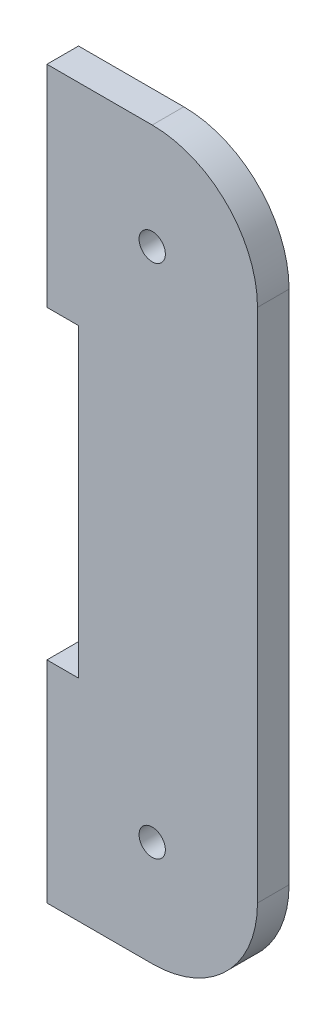
ISO-10303-21;
HEADER;
FILE_DESCRIPTION(('STEP AP214'),'2;1');
FILE_NAME('part.step','',(''),(''),'','','');
FILE_SCHEMA(('AUTOMOTIVE_DESIGN { 1 0 10303 214 1 1 1 1 }'));
ENDSEC;
DATA;
#1=APPLICATION_CONTEXT('core data for automotive mechanical design processes');
#2=APPLICATION_PROTOCOL_DEFINITION('international standard','automotive_design',2000,#1);
#3=PRODUCT_CONTEXT('',#1,'mechanical');
#4=PRODUCT('Part','Part','',(#3));
#5=PRODUCT_RELATED_PRODUCT_CATEGORY('part','',(#4));
#6=PRODUCT_DEFINITION_FORMATION('','',#4);
#7=PRODUCT_DEFINITION_CONTEXT('part definition',#1,'design');
#8=PRODUCT_DEFINITION('design','',#6,#7);
#9=PRODUCT_DEFINITION_SHAPE('','',#8);
#10=(LENGTH_UNIT() NAMED_UNIT(*) SI_UNIT(.MILLI.,.METRE.));
#11=(NAMED_UNIT(*) PLANE_ANGLE_UNIT() SI_UNIT($,.RADIAN.));
#12=(NAMED_UNIT(*) SI_UNIT($,.STERADIAN.) SOLID_ANGLE_UNIT());
#13=UNCERTAINTY_MEASURE_WITH_UNIT(LENGTH_MEASURE(1.E-05),#10,'distance_accuracy_value','');
#14=(GEOMETRIC_REPRESENTATION_CONTEXT(3) GLOBAL_UNCERTAINTY_ASSIGNED_CONTEXT((#13)) GLOBAL_UNIT_ASSIGNED_CONTEXT((#10,
#11,#12)) REPRESENTATION_CONTEXT('',''));
#15=CARTESIAN_POINT('',(0.,0.,0.));
#16=DIRECTION('',(0.,0.,1.));
#17=DIRECTION('',(1.,0.,0.));
#18=AXIS2_PLACEMENT_3D('',#15,#16,#17);
#19=CARTESIAN_POINT('',(-10.2040816326531,54.0510204081632,3.));
#20=DIRECTION('',(1.,0.,0.));
#21=DIRECTION('',(0.,1.,0.));
#22=AXIS2_PLACEMENT_3D('',#19,#20,#21);
#23=PLANE('',#22);
#24=DIRECTION('',(0.,0.,-1.));
#25=VECTOR('',#24,1.);
#26=CARTESIAN_POINT('',(-10.2040816326531,5.05102040816324,3.));
#27=LINE('',#26,#25);
#28=CARTESIAN_POINT('',(-10.2040816326531,5.05102040816324,3.));
#29=VERTEX_POINT('',#28);
#30=CARTESIAN_POINT('',(-10.2040816326531,5.05102040816324,0.));
#31=VERTEX_POINT('',#30);
#32=EDGE_CURVE('E112',#29,#31,#27,.T.);
#33=ORIENTED_EDGE('',*,*,#32,.T.);
#34=DIRECTION('',(0.,-1.,0.));
#35=VECTOR('',#34,1.);
#36=CARTESIAN_POINT('',(-10.2040816326531,54.0510204081632,0.));
#37=LINE('',#36,#35);
#38=CARTESIAN_POINT('',(-10.2040816326531,-14.9489795918368,0.));
#39=VERTEX_POINT('',#38);
#40=EDGE_CURVE('E122',#31,#39,#37,.T.);
#41=ORIENTED_EDGE('',*,*,#40,.T.);
#42=DIRECTION('',(0.,0.,-1.));
#43=VECTOR('',#42,1.);
#44=CARTESIAN_POINT('',(-10.2040816326531,-14.9489795918368,3.));
#45=LINE('',#44,#43);
#46=CARTESIAN_POINT('',(-10.2040816326531,-14.9489795918368,3.));
#47=VERTEX_POINT('',#46);
#48=EDGE_CURVE('E134',#47,#39,#45,.T.);
#49=ORIENTED_EDGE('',*,*,#48,.F.);
#50=DIRECTION('',(0.,-1.,0.));
#51=VECTOR('',#50,1.);
#52=CARTESIAN_POINT('',(-10.2040816326531,54.0510204081632,3.));
#53=LINE('',#52,#51);
#54=EDGE_CURVE('E127',#29,#47,#53,.T.);
#55=ORIENTED_EDGE('',*,*,#54,.F.);
#56=EDGE_LOOP('',(#33,#41,#49,#55));
#57=FACE_BOUND('',#56,.T.);
#58=ADVANCED_FACE('F33',(#57),#23,.F.);
#59=DIRECTION('',(0.,0.,-1.));
#60=VECTOR('',#59,1.);
#61=CARTESIAN_POINT('',(-10.2040816326531,34.0510204081632,3.));
#62=LINE('',#61,#60);
#63=CARTESIAN_POINT('',(-10.2040816326531,34.0510204081632,3.));
#64=VERTEX_POINT('',#63);
#65=CARTESIAN_POINT('',(-10.2040816326531,34.0510204081632,0.));
#66=VERTEX_POINT('',#65);
#67=EDGE_CURVE('E242',#64,#66,#62,.T.);
#68=ORIENTED_EDGE('',*,*,#67,.F.);
#69=CARTESIAN_POINT('',(-10.2040816326531,54.0510204081632,3.));
#70=VERTEX_POINT('',#69);
#71=EDGE_CURVE('E135',#70,#64,#53,.T.);
#72=ORIENTED_EDGE('',*,*,#71,.F.);
#73=DIRECTION('',(0.,0.,-1.));
#74=VECTOR('',#73,1.);
#75=CARTESIAN_POINT('',(-10.2040816326531,54.0510204081632,3.));
#76=LINE('',#75,#74);
#77=CARTESIAN_POINT('',(-10.2040816326531,54.0510204081632,0.));
#78=VERTEX_POINT('',#77);
#79=EDGE_CURVE('E149',#70,#78,#76,.T.);
#80=ORIENTED_EDGE('',*,*,#79,.T.);
#81=EDGE_CURVE('E150',#78,#66,#37,.T.);
#82=ORIENTED_EDGE('',*,*,#81,.T.);
#83=EDGE_LOOP('',(#68,#72,#80,#82));
#84=FACE_BOUND('',#83,.T.);
#85=ADVANCED_FACE('F195',(#84),#23,.F.);
#86=CARTESIAN_POINT('',(0.,0.,3.));
#87=DIRECTION('',(0.,0.,1.));
#88=DIRECTION('',(1.,0.,0.));
#89=AXIS2_PLACEMENT_3D('',#86,#87,#88);
#90=PLANE('',#89);
#91=CARTESIAN_POINT('',(-0.204081632653046,44.0510204081632,3.));
#92=DIRECTION('',(0.,0.,-1.));
#93=DIRECTION('',(-1.,0.,0.));
#94=AXIS2_PLACEMENT_3D('',#91,#92,#93);
#95=CIRCLE('',#94,1.25);
#96=CARTESIAN_POINT('',(-1.45408163265305,44.0510204081632,3.));
#97=VERTEX_POINT('',#96);
#98=EDGE_CURVE('E264',#97,#97,#95,.T.);
#99=ORIENTED_EDGE('',*,*,#98,.T.);
#100=EDGE_LOOP('',(#99));
#101=FACE_BOUND('',#100,.T.);
#102=CARTESIAN_POINT('',(-0.204081632653052,-4.94897959183675,3.));
#103=DIRECTION('',(0.,0.,-1.));
#104=DIRECTION('',(-1.,0.,0.));
#105=AXIS2_PLACEMENT_3D('',#102,#103,#104);
#106=CIRCLE('',#105,1.25);
#107=CARTESIAN_POINT('',(-1.45408163265305,-4.94897959183675,3.));
#108=VERTEX_POINT('',#107);
#109=EDGE_CURVE('E252',#108,#108,#106,.T.);
#110=ORIENTED_EDGE('',*,*,#109,.T.);
#111=EDGE_LOOP('',(#110));
#112=FACE_BOUND('',#111,.T.);
#113=DIRECTION('',(1.,0.,0.));
#114=VECTOR('',#113,1.);
#115=CARTESIAN_POINT('',(-10.2040816326531,-14.9489795918368,3.));
#116=LINE('',#115,#114);
#117=CARTESIAN_POINT('',(-0.204081632653055,-14.9489795918368,3.));
#118=VERTEX_POINT('',#117);
#119=EDGE_CURVE('E139',#47,#118,#116,.T.);
#120=ORIENTED_EDGE('',*,*,#119,.T.);
#121=CARTESIAN_POINT('',(-0.204081632653055,-4.94897959183675,3.));
#122=DIRECTION('',(0.,0.,1.));
#123=DIRECTION('',(1.,0.,0.));
#124=AXIS2_PLACEMENT_3D('',#121,#122,#123);
#125=CIRCLE('',#124,10.);
#126=CARTESIAN_POINT('',(9.79591836734695,-4.94897959183675,3.));
#127=VERTEX_POINT('',#126);
#128=EDGE_CURVE('E41',#118,#127,#125,.T.);
#129=ORIENTED_EDGE('',*,*,#128,.T.);
#130=DIRECTION('',(0.,1.,0.));
#131=VECTOR('',#130,1.);
#132=CARTESIAN_POINT('',(9.79591836734694,54.0510204081632,3.));
#133=LINE('',#132,#131);
#134=CARTESIAN_POINT('',(9.79591836734694,44.0510204081632,3.));
#135=VERTEX_POINT('',#134);
#136=EDGE_CURVE('E145',#127,#135,#133,.T.);
#137=ORIENTED_EDGE('',*,*,#136,.T.);
#138=CARTESIAN_POINT('',(-0.20408163265306,44.0510204081632,3.));
#139=DIRECTION('',(0.,0.,1.));
#140=DIRECTION('',(1.,0.,0.));
#141=AXIS2_PLACEMENT_3D('',#138,#139,#140);
#142=CIRCLE('',#141,10.);
#143=CARTESIAN_POINT('',(-0.20408163265306,54.0510204081632,3.));
#144=VERTEX_POINT('',#143);
#145=EDGE_CURVE('E48',#135,#144,#142,.T.);
#146=ORIENTED_EDGE('',*,*,#145,.T.);
#147=DIRECTION('',(-1.,0.,0.));
#148=VECTOR('',#147,1.);
#149=CARTESIAN_POINT('',(-10.2040816326531,54.0510204081632,3.));
#150=LINE('',#149,#148);
#151=EDGE_CURVE('E147',#144,#70,#150,.T.);
#152=ORIENTED_EDGE('',*,*,#151,.T.);
#153=ORIENTED_EDGE('',*,*,#71,.T.);
#154=DIRECTION('',(-1.,0.,0.));
#155=VECTOR('',#154,1.);
#156=CARTESIAN_POINT('',(-10.2040816326531,34.0510204081632,3.));
#157=LINE('',#156,#155);
#158=CARTESIAN_POINT('',(-7.20408163265306,34.0510204081632,3.));
#159=VERTEX_POINT('',#158);
#160=EDGE_CURVE('E243',#159,#64,#157,.T.);
#161=ORIENTED_EDGE('',*,*,#160,.F.);
#162=DIRECTION('',(0.,1.,0.));
#163=VECTOR('',#162,1.);
#164=CARTESIAN_POINT('',(-7.20408163265306,34.0510204081632,3.));
#165=LINE('',#164,#163);
#166=CARTESIAN_POINT('',(-7.20408163265306,5.05102040816324,3.));
#167=VERTEX_POINT('',#166);
#168=EDGE_CURVE('E129',#167,#159,#165,.T.);
#169=ORIENTED_EDGE('',*,*,#168,.F.);
#170=DIRECTION('',(1.,0.,0.));
#171=VECTOR('',#170,1.);
#172=CARTESIAN_POINT('',(-10.2040816326531,5.05102040816324,3.));
#173=LINE('',#172,#171);
#174=EDGE_CURVE('E115',#29,#167,#173,.T.);
#175=ORIENTED_EDGE('',*,*,#174,.F.);
#176=ORIENTED_EDGE('',*,*,#54,.T.);
#177=EDGE_LOOP('',(#120,#129,#137,#146,#152,#153,#161,#169,#175,#176));
#178=FACE_BOUND('',#177,.T.);
#179=ADVANCED_FACE('F126',(#101,#112,#178),#90,.T.);
#180=CARTESIAN_POINT('',(0.,0.,0.));
#181=DIRECTION('',(0.,0.,1.));
#182=DIRECTION('',(1.,0.,0.));
#183=AXIS2_PLACEMENT_3D('',#180,#181,#182);
#184=PLANE('',#183);
#185=CARTESIAN_POINT('',(-0.204081632653046,44.0510204081632,0.));
#186=DIRECTION('',(0.,0.,-1.));
#187=DIRECTION('',(-1.,0.,0.));
#188=AXIS2_PLACEMENT_3D('',#185,#186,#187);
#189=CIRCLE('',#188,1.24999999999999);
#190=CARTESIAN_POINT('',(-1.45408163265303,44.0510204081632,0.));
#191=VERTEX_POINT('',#190);
#192=EDGE_CURVE('E269',#191,#191,#189,.T.);
#193=ORIENTED_EDGE('',*,*,#192,.F.);
#194=EDGE_LOOP('',(#193));
#195=FACE_BOUND('',#194,.T.);
#196=CARTESIAN_POINT('',(-0.204081632653052,-4.94897959183675,0.));
#197=DIRECTION('',(0.,0.,-1.));
#198=DIRECTION('',(-1.,0.,0.));
#199=AXIS2_PLACEMENT_3D('',#196,#197,#198);
#200=CIRCLE('',#199,1.24999999999999);
#201=CARTESIAN_POINT('',(-1.45408163265304,-4.94897959183675,0.));
#202=VERTEX_POINT('',#201);
#203=EDGE_CURVE('E259',#202,#202,#200,.T.);
#204=ORIENTED_EDGE('',*,*,#203,.F.);
#205=EDGE_LOOP('',(#204));
#206=FACE_BOUND('',#205,.T.);
#207=DIRECTION('',(0.,1.,0.));
#208=VECTOR('',#207,1.);
#209=CARTESIAN_POINT('',(9.79591836734694,54.0510204081632,0.));
#210=LINE('',#209,#208);
#211=CARTESIAN_POINT('',(9.79591836734695,-4.94897959183675,0.));
#212=VERTEX_POINT('',#211);
#213=CARTESIAN_POINT('',(9.79591836734694,44.0510204081632,0.));
#214=VERTEX_POINT('',#213);
#215=EDGE_CURVE('E140',#212,#214,#210,.T.);
#216=ORIENTED_EDGE('',*,*,#215,.F.);
#217=CARTESIAN_POINT('',(-0.204081632653055,-4.94897959183675,0.));
#218=DIRECTION('',(0.,0.,1.));
#219=DIRECTION('',(1.,0.,0.));
#220=AXIS2_PLACEMENT_3D('',#217,#218,#219);
#221=CIRCLE('',#220,10.);
#222=CARTESIAN_POINT('',(-0.204081632653055,-14.9489795918368,0.));
#223=VERTEX_POINT('',#222);
#224=EDGE_CURVE('E167',#212,#223,#221,.F.);
#225=ORIENTED_EDGE('',*,*,#224,.T.);
#226=DIRECTION('',(1.,0.,0.));
#227=VECTOR('',#226,1.);
#228=CARTESIAN_POINT('',(-10.2040816326531,-14.9489795918368,0.));
#229=LINE('',#228,#227);
#230=EDGE_CURVE('E153',#39,#223,#229,.T.);
#231=ORIENTED_EDGE('',*,*,#230,.F.);
#232=ORIENTED_EDGE('',*,*,#40,.F.);
#233=DIRECTION('',(1.,0.,0.));
#234=VECTOR('',#233,1.);
#235=CARTESIAN_POINT('',(-10.2040816326531,5.05102040816324,0.));
#236=LINE('',#235,#234);
#237=CARTESIAN_POINT('',(-7.20408163265306,5.05102040816324,0.));
#238=VERTEX_POINT('',#237);
#239=EDGE_CURVE('E118',#31,#238,#236,.T.);
#240=ORIENTED_EDGE('',*,*,#239,.T.);
#241=DIRECTION('',(0.,1.,0.));
#242=VECTOR('',#241,1.);
#243=CARTESIAN_POINT('',(-7.20408163265306,34.0510204081632,0.));
#244=LINE('',#243,#242);
#245=CARTESIAN_POINT('',(-7.20408163265306,34.0510204081632,0.));
#246=VERTEX_POINT('',#245);
#247=EDGE_CURVE('E251',#238,#246,#244,.T.);
#248=ORIENTED_EDGE('',*,*,#247,.T.);
#249=DIRECTION('',(-1.,0.,0.));
#250=VECTOR('',#249,1.);
#251=CARTESIAN_POINT('',(-10.2040816326531,34.0510204081632,0.));
#252=LINE('',#251,#250);
#253=EDGE_CURVE('E130',#246,#66,#252,.T.);
#254=ORIENTED_EDGE('',*,*,#253,.T.);
#255=ORIENTED_EDGE('',*,*,#81,.F.);
#256=DIRECTION('',(-1.,0.,0.));
#257=VECTOR('',#256,1.);
#258=CARTESIAN_POINT('',(-10.2040816326531,54.0510204081632,0.));
#259=LINE('',#258,#257);
#260=CARTESIAN_POINT('',(-0.20408163265306,54.0510204081632,0.));
#261=VERTEX_POINT('',#260);
#262=EDGE_CURVE('E136',#261,#78,#259,.T.);
#263=ORIENTED_EDGE('',*,*,#262,.F.);
#264=CARTESIAN_POINT('',(-0.20408163265306,44.0510204081632,0.));
#265=DIRECTION('',(0.,0.,1.));
#266=DIRECTION('',(1.,0.,0.));
#267=AXIS2_PLACEMENT_3D('',#264,#265,#266);
#268=CIRCLE('',#267,10.);
#269=EDGE_CURVE('E165',#261,#214,#268,.F.);
#270=ORIENTED_EDGE('',*,*,#269,.T.);
#271=EDGE_LOOP('',(#216,#225,#231,#232,#240,#248,#254,#255,#263,#270));
#272=FACE_BOUND('',#271,.T.);
#273=ADVANCED_FACE('F181',(#195,#206,#272),#184,.F.);
#274=CARTESIAN_POINT('',(-10.2040816326531,-14.9489795918368,3.));
#275=DIRECTION('',(0.,1.,0.));
#276=DIRECTION('',(0.,0.,1.));
#277=AXIS2_PLACEMENT_3D('',#274,#275,#276);
#278=PLANE('',#277);
#279=ORIENTED_EDGE('',*,*,#230,.T.);
#280=DIRECTION('',(0.,0.,-1.));
#281=VECTOR('',#280,1.);
#282=CARTESIAN_POINT('',(-0.204081632653055,-14.9489795918368,3.));
#283=LINE('',#282,#281);
#284=EDGE_CURVE('E56',#223,#118,#283,.F.);
#285=ORIENTED_EDGE('',*,*,#284,.T.);
#286=ORIENTED_EDGE('',*,*,#119,.F.);
#287=ORIENTED_EDGE('',*,*,#48,.T.);
#288=EDGE_LOOP('',(#279,#285,#286,#287));
#289=FACE_BOUND('',#288,.T.);
#290=ADVANCED_FACE('F182',(#289),#278,.F.);
#291=CARTESIAN_POINT('',(9.79591836734694,54.0510204081632,3.));
#292=DIRECTION('',(-1.,0.,0.));
#293=DIRECTION('',(0.,-1.,0.));
#294=AXIS2_PLACEMENT_3D('',#291,#292,#293);
#295=PLANE('',#294);
#296=ORIENTED_EDGE('',*,*,#136,.F.);
#297=DIRECTION('',(0.,0.,-1.));
#298=VECTOR('',#297,1.);
#299=CARTESIAN_POINT('',(9.79591836734695,-4.94897959183675,3.));
#300=LINE('',#299,#298);
#301=EDGE_CURVE('E162',#127,#212,#300,.T.);
#302=ORIENTED_EDGE('',*,*,#301,.T.);
#303=ORIENTED_EDGE('',*,*,#215,.T.);
#304=DIRECTION('',(0.,0.,-1.));
#305=VECTOR('',#304,1.);
#306=CARTESIAN_POINT('',(9.79591836734694,44.0510204081632,3.));
#307=LINE('',#306,#305);
#308=EDGE_CURVE('E160',#214,#135,#307,.F.);
#309=ORIENTED_EDGE('',*,*,#308,.T.);
#310=EDGE_LOOP('',(#296,#302,#303,#309));
#311=FACE_BOUND('',#310,.T.);
#312=ADVANCED_FACE('F175',(#311),#295,.F.);
#313=CARTESIAN_POINT('',(-10.2040816326531,54.0510204081632,3.));
#314=DIRECTION('',(0.,-1.,0.));
#315=DIRECTION('',(0.,0.,-1.));
#316=AXIS2_PLACEMENT_3D('',#313,#314,#315);
#317=PLANE('',#316);
#318=ORIENTED_EDGE('',*,*,#151,.F.);
#319=DIRECTION('',(0.,0.,-1.));
#320=VECTOR('',#319,1.);
#321=CARTESIAN_POINT('',(-0.20408163265306,54.0510204081632,3.));
#322=LINE('',#321,#320);
#323=EDGE_CURVE('E11',#144,#261,#322,.T.);
#324=ORIENTED_EDGE('',*,*,#323,.T.);
#325=ORIENTED_EDGE('',*,*,#262,.T.);
#326=ORIENTED_EDGE('',*,*,#79,.F.);
#327=EDGE_LOOP('',(#318,#324,#325,#326));
#328=FACE_BOUND('',#327,.T.);
#329=ADVANCED_FACE('F189',(#328),#317,.F.);
#330=CARTESIAN_POINT('',(-10.2040816326531,5.05102040816324,3.));
#331=DIRECTION('',(0.,1.,0.));
#332=DIRECTION('',(0.,0.,1.));
#333=AXIS2_PLACEMENT_3D('',#330,#331,#332);
#334=PLANE('',#333);
#335=ORIENTED_EDGE('',*,*,#239,.F.);
#336=ORIENTED_EDGE('',*,*,#32,.F.);
#337=ORIENTED_EDGE('',*,*,#174,.T.);
#338=DIRECTION('',(0.,0.,-1.));
#339=VECTOR('',#338,1.);
#340=CARTESIAN_POINT('',(-7.20408163265306,5.05102040816324,3.));
#341=LINE('',#340,#339);
#342=EDGE_CURVE('E123',#167,#238,#341,.T.);
#343=ORIENTED_EDGE('',*,*,#342,.T.);
#344=EDGE_LOOP('',(#335,#336,#337,#343));
#345=FACE_BOUND('',#344,.T.);
#346=ADVANCED_FACE('F114',(#345),#334,.T.);
#347=CARTESIAN_POINT('',(-7.20408163265306,34.0510204081632,3.));
#348=DIRECTION('',(-1.,0.,0.));
#349=DIRECTION('',(0.,-1.,0.));
#350=AXIS2_PLACEMENT_3D('',#347,#348,#349);
#351=PLANE('',#350);
#352=ORIENTED_EDGE('',*,*,#247,.F.);
#353=ORIENTED_EDGE('',*,*,#342,.F.);
#354=ORIENTED_EDGE('',*,*,#168,.T.);
#355=DIRECTION('',(0.,0.,-1.));
#356=VECTOR('',#355,1.);
#357=CARTESIAN_POINT('',(-7.20408163265306,34.0510204081632,3.));
#358=LINE('',#357,#356);
#359=EDGE_CURVE('E246',#159,#246,#358,.T.);
#360=ORIENTED_EDGE('',*,*,#359,.T.);
#361=EDGE_LOOP('',(#352,#353,#354,#360));
#362=FACE_BOUND('',#361,.T.);
#363=ADVANCED_FACE('F221',(#362),#351,.T.);
#364=CARTESIAN_POINT('',(-10.2040816326531,34.0510204081632,3.));
#365=DIRECTION('',(0.,-1.,0.));
#366=DIRECTION('',(0.,0.,-1.));
#367=AXIS2_PLACEMENT_3D('',#364,#365,#366);
#368=PLANE('',#367);
#369=ORIENTED_EDGE('',*,*,#253,.F.);
#370=ORIENTED_EDGE('',*,*,#359,.F.);
#371=ORIENTED_EDGE('',*,*,#160,.T.);
#372=ORIENTED_EDGE('',*,*,#67,.T.);
#373=EDGE_LOOP('',(#369,#370,#371,#372));
#374=FACE_BOUND('',#373,.T.);
#375=ADVANCED_FACE('F213',(#374),#368,.T.);
#376=CARTESIAN_POINT('',(-0.204081632653052,-4.94897959183675,0.));
#377=DIRECTION('',(0.,0.,-1.));
#378=DIRECTION('',(-1.,0.,0.));
#379=AXIS2_PLACEMENT_3D('',#376,#377,#378);
#380=CYLINDRICAL_SURFACE('',#379,1.24999999999999);
#381=ORIENTED_EDGE('',*,*,#109,.F.);
#382=EDGE_LOOP('',(#381));
#383=FACE_BOUND('',#382,.T.);
#384=ORIENTED_EDGE('',*,*,#203,.T.);
#385=EDGE_LOOP('',(#384));
#386=FACE_BOUND('',#385,.T.);
#387=ADVANCED_FACE('F207',(#383,#386),#380,.F.);
#388=CARTESIAN_POINT('',(-0.204081632653046,44.0510204081632,0.));
#389=DIRECTION('',(0.,0.,-1.));
#390=DIRECTION('',(-1.,0.,0.));
#391=AXIS2_PLACEMENT_3D('',#388,#389,#390);
#392=CYLINDRICAL_SURFACE('',#391,1.24999999999999);
#393=ORIENTED_EDGE('',*,*,#98,.F.);
#394=EDGE_LOOP('',(#393));
#395=FACE_BOUND('',#394,.T.);
#396=ORIENTED_EDGE('',*,*,#192,.T.);
#397=EDGE_LOOP('',(#396));
#398=FACE_BOUND('',#397,.T.);
#399=ADVANCED_FACE('F201',(#395,#398),#392,.F.);
#400=CARTESIAN_POINT('',(-0.204081632653055,-4.94897959183675,3.));
#401=DIRECTION('',(0.,0.,-1.));
#402=DIRECTION('',(-1.,0.,0.));
#403=AXIS2_PLACEMENT_3D('',#400,#401,#402);
#404=CYLINDRICAL_SURFACE('',#403,10.);
#405=ORIENTED_EDGE('',*,*,#128,.F.);
#406=ORIENTED_EDGE('',*,*,#284,.F.);
#407=ORIENTED_EDGE('',*,*,#224,.F.);
#408=ORIENTED_EDGE('',*,*,#301,.F.);
#409=EDGE_LOOP('',(#405,#406,#407,#408));
#410=FACE_BOUND('',#409,.T.);
#411=ADVANCED_FACE('F178',(#410),#404,.T.);
#412=CARTESIAN_POINT('',(-0.20408163265306,44.0510204081632,3.));
#413=DIRECTION('',(0.,0.,-1.));
#414=DIRECTION('',(-1.,0.,0.));
#415=AXIS2_PLACEMENT_3D('',#412,#413,#414);
#416=CYLINDRICAL_SURFACE('',#415,10.);
#417=ORIENTED_EDGE('',*,*,#145,.F.);
#418=ORIENTED_EDGE('',*,*,#308,.F.);
#419=ORIENTED_EDGE('',*,*,#269,.F.);
#420=ORIENTED_EDGE('',*,*,#323,.F.);
#421=EDGE_LOOP('',(#417,#418,#419,#420));
#422=FACE_BOUND('',#421,.T.);
#423=ADVANCED_FACE('F35',(#422),#416,.T.);
#424=CLOSED_SHELL('',(#58,#85,#179,#273,#290,#312,#329,#346,#363,#375,#387,#399,#411,#423));
#425=MANIFOLD_SOLID_BREP('B2',#424);
#426=ADVANCED_BREP_SHAPE_REPRESENTATION('',(#18,#425),#14);
#427=SHAPE_DEFINITION_REPRESENTATION(#9,#426);
ENDSEC;
END-ISO-10303-21;
